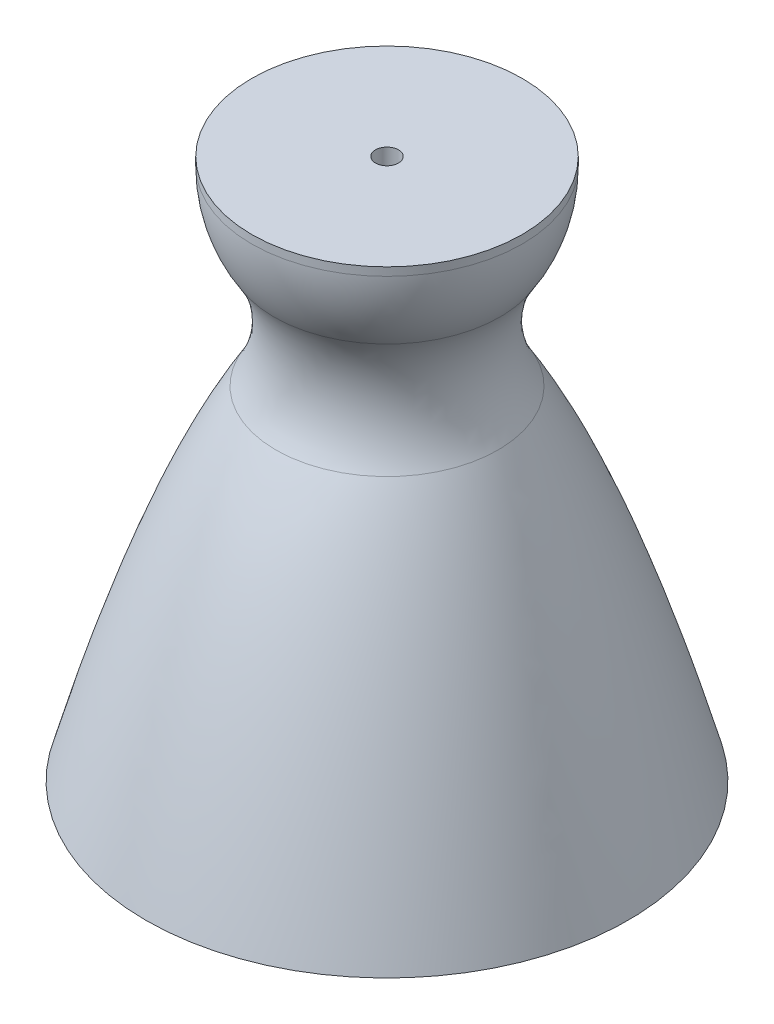
ISO-10303-21;
HEADER;
FILE_DESCRIPTION(('STEP AP214'),'2;1');
FILE_NAME('part.step','',(''),(''),'','','');
FILE_SCHEMA(('AUTOMOTIVE_DESIGN { 1 0 10303 214 1 1 1 1 }'));
ENDSEC;
DATA;
#1=APPLICATION_CONTEXT('core data for automotive mechanical design processes');
#2=APPLICATION_PROTOCOL_DEFINITION('international standard','automotive_design',2000,#1);
#3=PRODUCT_CONTEXT('',#1,'mechanical');
#4=PRODUCT('Part','Part','',(#3));
#5=PRODUCT_RELATED_PRODUCT_CATEGORY('part','',(#4));
#6=PRODUCT_DEFINITION_FORMATION('','',#4);
#7=PRODUCT_DEFINITION_CONTEXT('part definition',#1,'design');
#8=PRODUCT_DEFINITION('design','',#6,#7);
#9=PRODUCT_DEFINITION_SHAPE('','',#8);
#10=(LENGTH_UNIT() NAMED_UNIT(*) SI_UNIT(.MILLI.,.METRE.));
#11=(NAMED_UNIT(*) PLANE_ANGLE_UNIT() SI_UNIT($,.RADIAN.));
#12=(NAMED_UNIT(*) SI_UNIT($,.STERADIAN.) SOLID_ANGLE_UNIT());
#13=UNCERTAINTY_MEASURE_WITH_UNIT(LENGTH_MEASURE(1.E-05),#10,'distance_accuracy_value','');
#14=(GEOMETRIC_REPRESENTATION_CONTEXT(3) GLOBAL_UNCERTAINTY_ASSIGNED_CONTEXT((#13)) GLOBAL_UNIT_ASSIGNED_CONTEXT((#10,
#11,#12)) REPRESENTATION_CONTEXT('',''));
#15=CARTESIAN_POINT('',(0.,0.,0.));
#16=DIRECTION('',(0.,0.,1.));
#17=DIRECTION('',(1.,0.,0.));
#18=AXIS2_PLACEMENT_3D('',#15,#16,#17);
#19=CARTESIAN_POINT('',(0.,-999683.869484588,-19093.6308404544));
#20=CARTESIAN_POINT('',(0.,1000089.21331011,11883.9252536036));
#21=CARTESIAN_POINT('',(0.,-999855.245906024,-4673.60180987999));
#22=B_SPLINE_CURVE_WITH_KNOTS('',2,(#19,#20,#21),.UNSPECIFIED.,.F.,.F.,(3,3),(0.,1.),.UNSPECIFIED.);
#23=CARTESIAN_POINT('',(0.,180.,0.));
#24=DIRECTION('',(0.,1.,0.));
#25=AXIS1_PLACEMENT('',#23,#24);
#26=SURFACE_OF_REVOLUTION('',#22,#25);
#27=CARTESIAN_POINT('',(0.,-2.39808173319034E-11,0.));
#28=DIRECTION('',(0.,1.,0.));
#29=DIRECTION('',(0.,0.,1.));
#30=AXIS2_PLACEMENT_3D('',#27,#28,#29);
#31=CIRCLE('',#30,89.1138011030141);
#32=CARTESIAN_POINT('',(0.,-2.39808173319034E-11,89.1138011030141));
#33=VERTEX_POINT('',#32);
#34=EDGE_CURVE('E58',#33,#33,#31,.T.);
#35=ORIENTED_EDGE('',*,*,#34,.T.);
#36=EDGE_LOOP('',(#35));
#37=FACE_BOUND('',#36,.T.);
#38=CARTESIAN_POINT('',(0.,126.539075673714,0.));
#39=DIRECTION('',(0.,1.,0.));
#40=DIRECTION('',(0.,0.,1.));
#41=AXIS2_PLACEMENT_3D('',#38,#39,#40);
#42=CIRCLE('',#41,41.0575398289);
#43=CARTESIAN_POINT('',(0.,126.539075673714,41.0575398289));
#44=VERTEX_POINT('',#43);
#45=EDGE_CURVE('E10',#44,#44,#42,.T.);
#46=ORIENTED_EDGE('',*,*,#45,.F.);
#47=EDGE_LOOP('',(#46));
#48=FACE_BOUND('',#47,.T.);
#49=ADVANCED_FACE('F35',(#37,#48),#26,.F.);
#50=CARTESIAN_POINT('',(0.,147.444755445763,0.));
#51=DIRECTION('',(0.,1.,0.));
#52=DIRECTION('',(0.,0.,1.));
#53=AXIS2_PLACEMENT_3D('',#50,#51,#52);
#54=TOROIDAL_SURFACE('',#53,75.1596299885086,39.9999999998192);
#55=ORIENTED_EDGE('',*,*,#45,.T.);
#56=EDGE_LOOP('',(#55));
#57=FACE_BOUND('',#56,.T.);
#58=CARTESIAN_POINT('',(0.,169.448257755643,0.));
#59=DIRECTION('',(0.,1.,0.));
#60=DIRECTION('',(0.,0.,1.));
#61=AXIS2_PLACEMENT_3D('',#58,#59,#60);
#62=CIRCLE('',#61,41.7553505308603);
#63=CARTESIAN_POINT('',(0.,169.448257755643,41.7553505308603));
#64=VERTEX_POINT('',#63);
#65=EDGE_CURVE('E43',#64,#64,#62,.T.);
#66=ORIENTED_EDGE('',*,*,#65,.F.);
#67=EDGE_LOOP('',(#66));
#68=FACE_BOUND('',#67,.T.);
#69=ADVANCED_FACE('F90',(#57,#68),#54,.F.);
#70=CARTESIAN_POINT('',(0.,196.952633808579,0.));
#71=DIRECTION('',(0.,1.,0.));
#72=DIRECTION('',(0.,0.,1.));
#73=AXIS2_PLACEMENT_3D('',#70,#71,#72);
#74=SPHERICAL_SURFACE('',#73,50.000000000172);
#75=ORIENTED_EDGE('',*,*,#65,.T.);
#76=EDGE_LOOP('',(#75));
#77=FACE_BOUND('',#76,.T.);
#78=CARTESIAN_POINT('',(0.,196.952633808579,0.));
#79=DIRECTION('',(0.,1.,0.));
#80=DIRECTION('',(0.,0.,1.));
#81=AXIS2_PLACEMENT_3D('',#78,#79,#80);
#82=CIRCLE('',#81,50.000000000172);
#83=CARTESIAN_POINT('',(0.,196.952633808579,50.000000000172));
#84=VERTEX_POINT('',#83);
#85=EDGE_CURVE('E47',#84,#84,#82,.T.);
#86=ORIENTED_EDGE('',*,*,#85,.F.);
#87=EDGE_LOOP('',(#86));
#88=FACE_BOUND('',#87,.T.);
#89=ADVANCED_FACE('F87',(#77,#88),#74,.T.);
#90=CARTESIAN_POINT('',(0.,180.,0.));
#91=DIRECTION('',(0.,1.,0.));
#92=DIRECTION('',(0.,0.,1.));
#93=AXIS2_PLACEMENT_3D('',#90,#91,#92);
#94=CYLINDRICAL_SURFACE('',#93,50.000000000086);
#95=ORIENTED_EDGE('',*,*,#85,.T.);
#96=EDGE_LOOP('',(#95));
#97=FACE_BOUND('',#96,.T.);
#98=CARTESIAN_POINT('',(0.,200.,0.));
#99=DIRECTION('',(0.,1.,0.));
#100=DIRECTION('',(0.,0.,1.));
#101=AXIS2_PLACEMENT_3D('',#98,#99,#100);
#102=CIRCLE('',#101,50.);
#103=CARTESIAN_POINT('',(0.,200.,50.));
#104=VERTEX_POINT('',#103);
#105=EDGE_CURVE('E52',#104,#104,#102,.T.);
#106=ORIENTED_EDGE('',*,*,#105,.F.);
#107=EDGE_LOOP('',(#106));
#108=FACE_BOUND('',#107,.T.);
#109=ADVANCED_FACE('F83',(#97,#108),#94,.T.);
#110=CARTESIAN_POINT('',(0.,200.,50.));
#111=DIRECTION('',(0.,1.,0.));
#112=DIRECTION('',(0.,0.,1.));
#113=AXIS2_PLACEMENT_3D('',#110,#111,#112);
#114=PLANE('',#113);
#115=CARTESIAN_POINT('',(0.,200.,0.));
#116=DIRECTION('',(0.,1.,0.));
#117=DIRECTION('',(0.,0.,1.));
#118=AXIS2_PLACEMENT_3D('',#115,#116,#117);
#119=CIRCLE('',#118,4.25);
#120=CARTESIAN_POINT('',(0.,200.,4.25));
#121=VERTEX_POINT('',#120);
#122=EDGE_CURVE('E135',#121,#121,#119,.T.);
#123=ORIENTED_EDGE('',*,*,#122,.F.);
#124=EDGE_LOOP('',(#123));
#125=FACE_BOUND('',#124,.T.);
#126=ORIENTED_EDGE('',*,*,#105,.T.);
#127=EDGE_LOOP('',(#126));
#128=FACE_BOUND('',#127,.T.);
#129=ADVANCED_FACE('F78',(#125,#128),#114,.T.);
#130=CARTESIAN_POINT('',(0.,-0.790944386723598,86.219944337888));
#131=CARTESIAN_POINT('',(0.,-0.59453137327353,86.1662610414852));
#132=CARTESIAN_POINT('',(0.,-0.263086515469004,86.075583411911));
#133=CARTESIAN_POINT('',(0.,1.5369739289784,85.5823147601887));
#134=CARTESIAN_POINT('',(0.,4.92300154280033,84.6470709010546));
#135=CARTESIAN_POINT('',(0.,11.629508828027,82.7639709513079));
#136=CARTESIAN_POINT('',(0.,20.2000194191196,80.2903005164233));
#137=CARTESIAN_POINT('',(0.,30.1061344095549,77.3204732034794));
#138=CARTESIAN_POINT('',(0.,42.8221877886212,73.3554760806207));
#139=CARTESIAN_POINT('',(0.,57.7881712597135,68.3913995401836));
#140=CARTESIAN_POINT('',(0.,74.2607847272697,62.4229693158048));
#141=CARTESIAN_POINT('',(0.,89.2437917608686,56.4453860050229));
#142=CARTESIAN_POINT('',(0.,100.486184280585,51.4588237281846));
#143=CARTESIAN_POINT('',(0.,108.731345719666,47.4692724425986));
#144=CARTESIAN_POINT('',(0.,114.542174666197,44.4766251365694));
#145=CARTESIAN_POINT('',(0.,119.066741733617,41.9871034343959));
#146=CARTESIAN_POINT('',(0.,122.509882381483,39.9898374273432));
#147=CARTESIAN_POINT('',(0.,124.147950452964,39.0045307165634));
#148=CARTESIAN_POINT('',(0.,124.97114969066,38.4998830667765));
#149=B_SPLINE_CURVE_WITH_KNOTS('',3,(#130,#131,#132,#133,#134,#135,#136,#137,#138,#139,#140,
#141,#142,#143,#144,#145,#146,#147,#148),.UNSPECIFIED.,.F.,.F.,(4,1,1,1,1,1,1,1,1,1,1,1,1,1,1,1,
4),(0.502863577233422,0.502875351171239,0.502883200463117,0.502970965041153,0.503078352848884,
0.503293128464346,0.503507904079808,0.503722679695269,0.504152230926193,0.504581782157116,
0.505011333388039,0.505440884618963,0.505655660234425,0.505870435849886,0.506085211465348,
0.506192599273079,0.50629998708081),.UNSPECIFIED.);
#150=CARTESIAN_POINT('',(0.,180.,0.));
#151=DIRECTION('',(0.,1.,0.));
#152=AXIS1_PLACEMENT('',#150,#151);
#153=SURFACE_OF_REVOLUTION('',#149,#152);
#154=CARTESIAN_POINT('',(0.,124.971149690673,4.28682161116035E-13));
#155=DIRECTION('',(0.,-1.,0.));
#156=DIRECTION('',(0.,0.,-1.));
#157=AXIS2_PLACEMENT_3D('',#154,#155,#156);
#158=CIRCLE('',#157,38.4998830667965);
#159=CARTESIAN_POINT('',(0.,124.971149690673,-38.4998830667961));
#160=VERTEX_POINT('',#159);
#161=EDGE_CURVE('E61',#160,#160,#158,.T.);
#162=ORIENTED_EDGE('',*,*,#161,.F.);
#163=EDGE_LOOP('',(#162));
#164=FACE_BOUND('',#163,.T.);
#165=CARTESIAN_POINT('',(0.,-1.05631003943785E-07,0.));
#166=DIRECTION('',(0.,1.,0.));
#167=DIRECTION('',(0.,0.,1.));
#168=AXIS2_PLACEMENT_3D('',#165,#166,#167);
#169=CIRCLE('',#168,86.0034842394126);
#170=CARTESIAN_POINT('',(0.,-1.05631003943785E-07,86.0034842394126));
#171=VERTEX_POINT('',#170);
#172=EDGE_CURVE('E55',#171,#171,#169,.T.);
#173=ORIENTED_EDGE('',*,*,#172,.F.);
#174=EDGE_LOOP('',(#173));
#175=FACE_BOUND('',#174,.T.);
#176=ADVANCED_FACE('F73',(#164,#175),#153,.F.);
#177=CARTESIAN_POINT('',(0.,-5.28274959076035E-08,89.1138011030141));
#178=DIRECTION('',(0.,-1.,0.));
#179=DIRECTION('',(0.,0.,-1.));
#180=AXIS2_PLACEMENT_3D('',#177,#178,#179);
#181=PLANE('',#180);
#182=ORIENTED_EDGE('',*,*,#172,.T.);
#183=EDGE_LOOP('',(#182));
#184=FACE_BOUND('',#183,.T.);
#185=ORIENTED_EDGE('',*,*,#34,.F.);
#186=EDGE_LOOP('',(#185));
#187=FACE_BOUND('',#186,.T.);
#188=ADVANCED_FACE('F77',(#184,#187),#181,.T.);
#189=CARTESIAN_POINT('',(0.,130.854414052848,4.48863222804567E-13));
#190=DIRECTION('',(0.,-1.,0.));
#191=DIRECTION('',(0.,0.,-1.));
#192=AXIS2_PLACEMENT_3D('',#189,#190,#191);
#193=CONICAL_SURFACE('',#192,33.8610889572517,0.785398163397455);
#194=CARTESIAN_POINT('',(0.,160.4655030101,5.50436631056096E-13));
#195=DIRECTION('',(0.,-1.,0.));
#196=DIRECTION('',(0.,0.,-1.));
#197=AXIS2_PLACEMENT_3D('',#194,#195,#196);
#198=CIRCLE('',#197,4.25);
#199=CARTESIAN_POINT('',(0.,160.4655030101,-4.24999999999945));
#200=VERTEX_POINT('',#199);
#201=EDGE_CURVE('E39',#200,#200,#198,.F.);
#202=CARTESIAN_POINT('',(0.,130.854414052848,4.48863222804567E-13));
#203=DIRECTION('',(0.,-1.,0.));
#204=DIRECTION('',(0.,0.,-1.));
#205=AXIS2_PLACEMENT_3D('',#202,#203,#204);
#206=CIRCLE('',#205,33.8610889572517);
#207=CARTESIAN_POINT('',(0.,130.854414052849,-33.8610889572512));
#208=VERTEX_POINT('',#207);
#209=EDGE_CURVE('E137',#208,#208,#206,.T.);
#210=CARTESIAN_POINT('',(0.,160.4655030101,-4.24999999999945));
#211=CARTESIAN_POINT('',(0.,160.157054166795,-4.55844884330416));
#212=CARTESIAN_POINT('',(0.,159.84860532349,-4.86689768660887));
#213=CARTESIAN_POINT('',(0.,159.231707636881,-5.48379537321828));
#214=CARTESIAN_POINT('',(0.,158.923258793576,-5.79224421652298));
#215=CARTESIAN_POINT('',(0.,158.306361106967,-6.40914190313239));
#216=CARTESIAN_POINT('',(0.,157.997912263662,-6.7175907464371));
#217=CARTESIAN_POINT('',(0.,157.381014577053,-7.33448843304651));
#218=CARTESIAN_POINT('',(0.,157.072565733748,-7.64293727635122));
#219=CARTESIAN_POINT('',(0.,156.455668047139,-8.25983496296063));
#220=CARTESIAN_POINT('',(0.,156.147219203834,-8.56828380626533));
#221=CARTESIAN_POINT('',(0.,155.530321517225,-9.18518149287475));
#222=CARTESIAN_POINT('',(0.,155.22187267392,-9.49363033617945));
#223=CARTESIAN_POINT('',(0.,154.60497498731,-10.1105280227889));
#224=CARTESIAN_POINT('',(0.,154.296526144006,-10.4189768660936));
#225=CARTESIAN_POINT('',(0.,153.679628457396,-11.035874552703));
#226=CARTESIAN_POINT('',(0.,153.371179614092,-11.3443233960077));
#227=CARTESIAN_POINT('',(0.,152.754281927482,-11.9612210826171));
#228=CARTESIAN_POINT('',(0.,152.445833084178,-12.2696699259218));
#229=CARTESIAN_POINT('',(0.,151.828935397568,-12.8865676125312));
#230=CARTESIAN_POINT('',(0.,151.520486554263,-13.1950164558359));
#231=CARTESIAN_POINT('',(0.,150.903588867654,-13.8119141424453));
#232=CARTESIAN_POINT('',(0.,150.595140024349,-14.12036298575));
#233=CARTESIAN_POINT('',(0.,149.97824233774,-14.7372606723595));
#234=CARTESIAN_POINT('',(0.,149.669793494435,-15.0457095156642));
#235=CARTESIAN_POINT('',(0.,149.052895807826,-15.6626072022736));
#236=CARTESIAN_POINT('',(0.,148.744446964521,-15.9710560455783));
#237=CARTESIAN_POINT('',(0.,148.127549277912,-16.5879537321877));
#238=CARTESIAN_POINT('',(0.,147.819100434607,-16.8964025754924));
#239=CARTESIAN_POINT('',(0.,147.202202747998,-17.5133002621018));
#240=CARTESIAN_POINT('',(0.,146.893753904693,-17.8217491054065));
#241=CARTESIAN_POINT('',(0.,146.276856218084,-18.4386467920159));
#242=CARTESIAN_POINT('',(0.,145.968407374779,-18.7470956353206));
#243=CARTESIAN_POINT('',(0.,145.351509688169,-19.36399332193));
#244=CARTESIAN_POINT('',(0.,145.043060844865,-19.6724421652348));
#245=CARTESIAN_POINT('',(0.,144.426163158255,-20.2893398518442));
#246=CARTESIAN_POINT('',(0.,144.117714314951,-20.5977886951489));
#247=CARTESIAN_POINT('',(0.,143.500816628341,-21.2146863817583));
#248=CARTESIAN_POINT('',(0.,143.192367785037,-21.523135225063));
#249=CARTESIAN_POINT('',(0.,142.575470098427,-22.1400329116724));
#250=CARTESIAN_POINT('',(0.,142.267021255123,-22.4484817549771));
#251=CARTESIAN_POINT('',(0.,141.650123568513,-23.0653794415865));
#252=CARTESIAN_POINT('',(0.,141.341674725208,-23.3738282848912));
#253=CARTESIAN_POINT('',(0.,140.724777038599,-23.9907259715006));
#254=CARTESIAN_POINT('',(0.,140.416328195294,-24.2991748148053));
#255=CARTESIAN_POINT('',(0.,139.799430508685,-24.9160725014148));
#256=CARTESIAN_POINT('',(0.,139.49098166538,-25.2245213447195));
#257=CARTESIAN_POINT('',(0.,138.874083978771,-25.8414190313289));
#258=CARTESIAN_POINT('',(0.,138.565635135466,-26.1498678746336));
#259=CARTESIAN_POINT('',(0.,137.948737448857,-26.766765561243));
#260=CARTESIAN_POINT('',(0.,137.640288605552,-27.0752144045477));
#261=CARTESIAN_POINT('',(0.,137.023390918943,-27.6921120911571));
#262=CARTESIAN_POINT('',(0.,136.714942075638,-28.0005609344618));
#263=CARTESIAN_POINT('',(0.,136.098044389028,-28.6174586210712));
#264=CARTESIAN_POINT('',(0.,135.789595545724,-28.9259074643759));
#265=CARTESIAN_POINT('',(0.,135.172697859114,-29.5428051509853));
#266=CARTESIAN_POINT('',(0.,134.86424901581,-29.8512539942901));
#267=CARTESIAN_POINT('',(0.,134.2473513292,-30.4681516808995));
#268=CARTESIAN_POINT('',(0.,133.938902485896,-30.7766005242042));
#269=CARTESIAN_POINT('',(0.,133.322004799286,-31.3934982108136));
#270=CARTESIAN_POINT('',(0.,133.013555955982,-31.7019470541183));
#271=CARTESIAN_POINT('',(0.,132.396658269372,-32.3188447407277));
#272=CARTESIAN_POINT('',(0.,132.088209426067,-32.6272935840324));
#273=CARTESIAN_POINT('',(0.,131.471311739458,-33.2441912706418));
#274=CARTESIAN_POINT('',(0.,131.162862896153,-33.5526401139465));
#275=CARTESIAN_POINT('',(0.,130.854414052849,-33.8610889572512));
#276=B_SPLINE_CURVE_WITH_KNOTS('',3,(#210,#211,#212,#213,#214,#215,#216,#217,#218,#219,#220,
#221,#222,#223,#224,#225,#226,#227,#228,#229,#230,#231,#232,#233,#234,#235,#236,#237,#238,#239,
#240,#241,#242,#243,#244,#245,#246,#247,#248,#249,#250,#251,#252,#253,#254,#255,#256,#257,#258,
#259,#260,#261,#262,#263,#264,#265,#266,#267,#268,#269,#270,#271,#272,#273,#274,#275),
.UNSPECIFIED.,.F.,.F.,(4,2,2,2,2,2,2,2,2,2,2,2,2,2,2,2,2,2,2,2,2,2,2,2,2,2,2,2,2,2,2,2,4),(0.,
1.3086376124994,2.61727522499882,3.92591283749823,5.23455044999765,6.54318806249707,
7.85182567499647,9.16046328749589,10.4691008999953,11.7777385124947,13.0863761249941,
14.3950137374935,15.703651349993,17.0122889624924,18.3209265749918,19.6295641874912,
20.9382017999906,22.24683941249,23.5554770249894,24.8641146374888,26.1727522499883,
27.4813898624877,28.7900274749871,30.0986650874865,31.4073026999859,32.7159403124853,
34.0245779249848,35.3332155374841,36.6418531499836,37.950490762483,39.2591283749824,
40.5677659874818,41.8764035999812),.UNSPECIFIED.);
#277=EDGE_CURVE('BSEAM110',#200,#208,#276,.T.);
#278=ORIENTED_EDGE('',*,*,#201,.T.);
#279=ORIENTED_EDGE('',*,*,#209,.T.);
#280=ORIENTED_EDGE('',*,*,#277,.T.);
#281=ORIENTED_EDGE('',*,*,#277,.F.);
#282=EDGE_LOOP('',(#278,#280,#279,#281));
#283=FACE_BOUND('',#282,.T.);
#284=ADVANCED_FACE('F110',(#283),#193,.F.);
#285=CARTESIAN_POINT('',(0.,108.302163315306,3.72965547335014E-13));
#286=DIRECTION('',(0.,-1.,0.));
#287=DIRECTION('',(0.,0.,-1.));
#288=AXIS2_PLACEMENT_3D('',#285,#286,#287);
#289=DEGENERATE_TOROIDAL_SURFACE('',#288,11.3088382197096,31.8936988550709,.T.);
#290=ORIENTED_EDGE('',*,*,#209,.F.);
#291=EDGE_LOOP('',(#290));
#292=FACE_BOUND('',#291,.T.);
#293=ORIENTED_EDGE('',*,*,#161,.T.);
#294=EDGE_LOOP('',(#293));
#295=FACE_BOUND('',#294,.T.);
#296=ADVANCED_FACE('F115',(#292,#295),#289,.F.);
#297=CARTESIAN_POINT('',(0.,-1.05631003943785E-07,0.));
#298=DIRECTION('',(0.,1.,0.));
#299=DIRECTION('',(0.,0.,1.));
#300=AXIS2_PLACEMENT_3D('',#297,#298,#299);
#301=CYLINDRICAL_SURFACE('',#300,4.25);
#302=ORIENTED_EDGE('',*,*,#122,.T.);
#303=EDGE_LOOP('',(#302));
#304=FACE_BOUND('',#303,.T.);
#305=ORIENTED_EDGE('',*,*,#201,.F.);
#306=EDGE_LOOP('',(#305));
#307=FACE_BOUND('',#306,.T.);
#308=ADVANCED_FACE('F123',(#304,#307),#301,.F.);
#309=CLOSED_SHELL('',(#49,#69,#89,#109,#129,#176,#188,#284,#296,#308));
#310=MANIFOLD_SOLID_BREP('B2',#309);
#311=ADVANCED_BREP_SHAPE_REPRESENTATION('',(#18,#310),#14);
#312=SHAPE_DEFINITION_REPRESENTATION(#9,#311);
ENDSEC;
END-ISO-10303-21;
